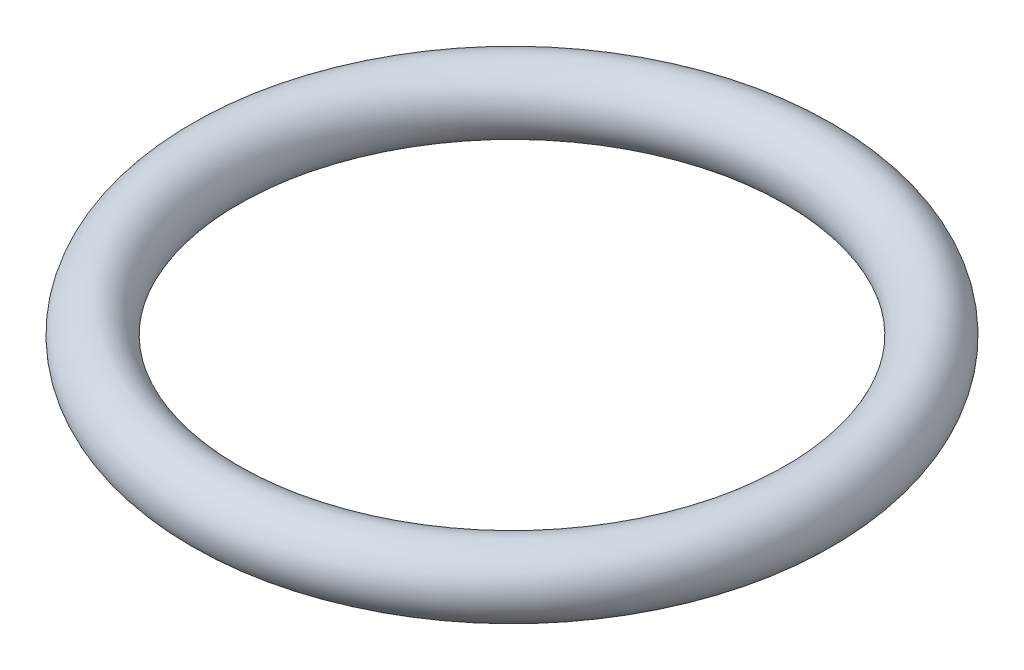
ISO-10303-21;
HEADER;
FILE_DESCRIPTION(('STEP AP214'),'2;1');
FILE_NAME('part.step','',(''),(''),'','','');
FILE_SCHEMA(('AUTOMOTIVE_DESIGN { 1 0 10303 214 1 1 1 1 }'));
ENDSEC;
DATA;
#1=APPLICATION_CONTEXT('core data for automotive mechanical design processes');
#2=APPLICATION_PROTOCOL_DEFINITION('international standard','automotive_design',2000,#1);
#3=PRODUCT_CONTEXT('',#1,'mechanical');
#4=PRODUCT('Part','Part','',(#3));
#5=PRODUCT_RELATED_PRODUCT_CATEGORY('part','',(#4));
#6=PRODUCT_DEFINITION_FORMATION('','',#4);
#7=PRODUCT_DEFINITION_CONTEXT('part definition',#1,'design');
#8=PRODUCT_DEFINITION('design','',#6,#7);
#9=PRODUCT_DEFINITION_SHAPE('','',#8);
#10=(LENGTH_UNIT() NAMED_UNIT(*) SI_UNIT(.MILLI.,.METRE.));
#11=(NAMED_UNIT(*) PLANE_ANGLE_UNIT() SI_UNIT($,.RADIAN.));
#12=(NAMED_UNIT(*) SI_UNIT($,.STERADIAN.) SOLID_ANGLE_UNIT());
#13=UNCERTAINTY_MEASURE_WITH_UNIT(LENGTH_MEASURE(1.E-05),#10,'distance_accuracy_value','');
#14=(GEOMETRIC_REPRESENTATION_CONTEXT(3) GLOBAL_UNCERTAINTY_ASSIGNED_CONTEXT((#13)) GLOBAL_UNIT_ASSIGNED_CONTEXT((#10,
#11,#12)) REPRESENTATION_CONTEXT('',''));
#15=CARTESIAN_POINT('',(0.,0.,0.));
#16=DIRECTION('',(0.,0.,1.));
#17=DIRECTION('',(1.,0.,0.));
#18=AXIS2_PLACEMENT_3D('',#15,#16,#17);
#19=CARTESIAN_POINT('',(0.,0.,0.));
#20=DIRECTION('',(0.,1.,0.));
#21=DIRECTION('',(0.,0.,1.));
#22=AXIS2_PLACEMENT_3D('',#19,#20,#21);
#23=TOROIDAL_SURFACE('',#22,22.5,2.5);
#24=CARTESIAN_POINT('',(0.,0.,22.5));
#25=DIRECTION('',(1.,0.,0.));
#26=DIRECTION('',(0.,0.,-1.));
#27=AXIS2_PLACEMENT_3D('',#24,#25,#26);
#28=CIRCLE('',#27,2.5);
#29=CARTESIAN_POINT('',(0.,0.,25.));
#30=VERTEX_POINT('',#29);
#31=EDGE_CURVE('E11',#30,#30,#28,.T.);
#32=CARTESIAN_POINT('',(0.,0.,0.));
#33=DIRECTION('',(0.,1.,0.));
#34=DIRECTION('',(0.,0.,1.));
#35=AXIS2_PLACEMENT_3D('',#32,#33,#34);
#36=CIRCLE('',#35,25.);
#37=EDGE_CURVE('',#30,#30,#36,.T.);
#38=ORIENTED_EDGE('',*,*,#31,.T.);
#39=ORIENTED_EDGE('',*,*,#31,.F.);
#40=ORIENTED_EDGE('',*,*,#37,.T.);
#41=ORIENTED_EDGE('',*,*,#37,.F.);
#42=EDGE_LOOP('',(#38,#40,#39,#41));
#43=FACE_BOUND('',#42,.T.);
#44=ADVANCED_FACE('F55',(#43),#23,.T.);
#45=CLOSED_SHELL('',(#44));
#46=MANIFOLD_SOLID_BREP('B2',#45);
#47=ADVANCED_BREP_SHAPE_REPRESENTATION('',(#18,#46),#14);
#48=SHAPE_DEFINITION_REPRESENTATION(#9,#47);
ENDSEC;
END-ISO-10303-21;
